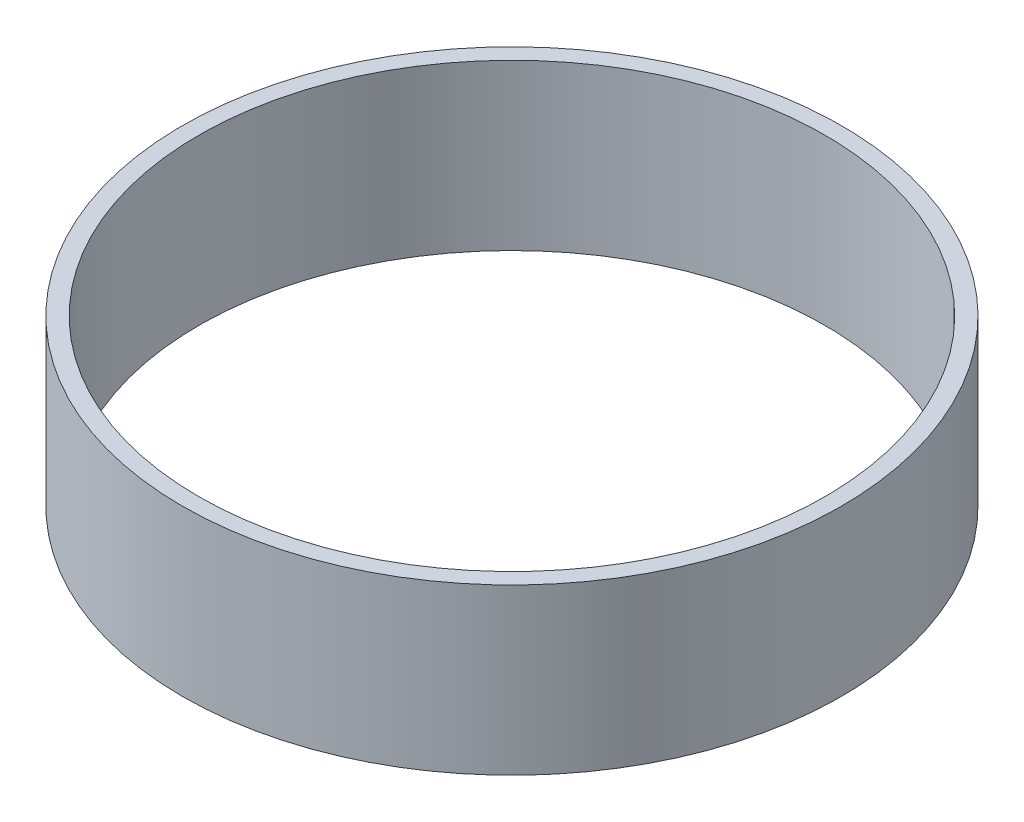
ISO-10303-21;
HEADER;
FILE_DESCRIPTION(('STEP AP214'),'2;1');
FILE_NAME('part.step','',(''),(''),'','','');
FILE_SCHEMA(('AUTOMOTIVE_DESIGN { 1 0 10303 214 1 1 1 1 }'));
ENDSEC;
DATA;
#1=APPLICATION_CONTEXT('core data for automotive mechanical design processes');
#2=APPLICATION_PROTOCOL_DEFINITION('international standard','automotive_design',2000,#1);
#3=PRODUCT_CONTEXT('',#1,'mechanical');
#4=PRODUCT('Part','Part','',(#3));
#5=PRODUCT_RELATED_PRODUCT_CATEGORY('part','',(#4));
#6=PRODUCT_DEFINITION_FORMATION('','',#4);
#7=PRODUCT_DEFINITION_CONTEXT('part definition',#1,'design');
#8=PRODUCT_DEFINITION('design','',#6,#7);
#9=PRODUCT_DEFINITION_SHAPE('','',#8);
#10=(LENGTH_UNIT() NAMED_UNIT(*) SI_UNIT(.MILLI.,.METRE.));
#11=(NAMED_UNIT(*) PLANE_ANGLE_UNIT() SI_UNIT($,.RADIAN.));
#12=(NAMED_UNIT(*) SI_UNIT($,.STERADIAN.) SOLID_ANGLE_UNIT());
#13=UNCERTAINTY_MEASURE_WITH_UNIT(LENGTH_MEASURE(1.E-05),#10,'distance_accuracy_value','');
#14=(GEOMETRIC_REPRESENTATION_CONTEXT(3) GLOBAL_UNCERTAINTY_ASSIGNED_CONTEXT((#13)) GLOBAL_UNIT_ASSIGNED_CONTEXT((#10,
#11,#12)) REPRESENTATION_CONTEXT('',''));
#15=CARTESIAN_POINT('',(0.,0.,0.));
#16=DIRECTION('',(0.,0.,1.));
#17=DIRECTION('',(1.,0.,0.));
#18=AXIS2_PLACEMENT_3D('',#15,#16,#17);
#19=CARTESIAN_POINT('',(0.,25.4,0.));
#20=DIRECTION('',(0.,1.,0.));
#21=DIRECTION('',(0.,0.,1.));
#22=AXIS2_PLACEMENT_3D('',#19,#20,#21);
#23=PLANE('',#22);
#24=CARTESIAN_POINT('',(0.,25.4,0.));
#25=DIRECTION('',(0.,1.,0.));
#26=DIRECTION('',(0.,0.,1.));
#27=AXIS2_PLACEMENT_3D('',#24,#25,#26);
#28=CIRCLE('',#27,50.8);
#29=CARTESIAN_POINT('',(0.,25.4,50.8));
#30=VERTEX_POINT('',#29);
#31=EDGE_CURVE('E10',#30,#30,#28,.T.);
#32=ORIENTED_EDGE('',*,*,#31,.T.);
#33=EDGE_LOOP('',(#32));
#34=FACE_BOUND('',#33,.T.);
#35=CARTESIAN_POINT('',(0.,25.4,0.));
#36=DIRECTION('',(0.,1.,0.));
#37=DIRECTION('',(0.,0.,1.));
#38=AXIS2_PLACEMENT_3D('',#35,#36,#37);
#39=CIRCLE('',#38,48.26);
#40=CARTESIAN_POINT('',(0.,25.4,48.26));
#41=VERTEX_POINT('',#40);
#42=EDGE_CURVE('E51',#41,#41,#39,.T.);
#43=ORIENTED_EDGE('',*,*,#42,.F.);
#44=EDGE_LOOP('',(#43));
#45=FACE_BOUND('',#44,.T.);
#46=ADVANCED_FACE('F38',(#34,#45),#23,.T.);
#47=CARTESIAN_POINT('',(0.,0.,0.));
#48=DIRECTION('',(0.,1.,0.));
#49=DIRECTION('',(0.,0.,1.));
#50=AXIS2_PLACEMENT_3D('',#47,#48,#49);
#51=PLANE('',#50);
#52=CARTESIAN_POINT('',(0.,0.,0.));
#53=DIRECTION('',(0.,1.,0.));
#54=DIRECTION('',(0.,0.,1.));
#55=AXIS2_PLACEMENT_3D('',#52,#53,#54);
#56=CIRCLE('',#55,50.8);
#57=CARTESIAN_POINT('',(0.,0.,50.8));
#58=VERTEX_POINT('',#57);
#59=EDGE_CURVE('E42',#58,#58,#56,.T.);
#60=ORIENTED_EDGE('',*,*,#59,.F.);
#61=EDGE_LOOP('',(#60));
#62=FACE_BOUND('',#61,.T.);
#63=CARTESIAN_POINT('',(0.,0.,0.));
#64=DIRECTION('',(0.,1.,0.));
#65=DIRECTION('',(0.,0.,1.));
#66=AXIS2_PLACEMENT_3D('',#63,#64,#65);
#67=CIRCLE('',#66,48.26);
#68=CARTESIAN_POINT('',(0.,0.,48.26));
#69=VERTEX_POINT('',#68);
#70=EDGE_CURVE('E53',#69,#69,#67,.T.);
#71=ORIENTED_EDGE('',*,*,#70,.T.);
#72=EDGE_LOOP('',(#71));
#73=FACE_BOUND('',#72,.T.);
#74=ADVANCED_FACE('F65',(#62,#73),#51,.F.);
#75=CARTESIAN_POINT('',(0.,25.4,0.));
#76=DIRECTION('',(0.,-1.,0.));
#77=DIRECTION('',(0.,0.,-1.));
#78=AXIS2_PLACEMENT_3D('',#75,#76,#77);
#79=CYLINDRICAL_SURFACE('',#78,50.8);
#80=ORIENTED_EDGE('',*,*,#31,.F.);
#81=EDGE_LOOP('',(#80));
#82=FACE_BOUND('',#81,.T.);
#83=ORIENTED_EDGE('',*,*,#59,.T.);
#84=EDGE_LOOP('',(#83));
#85=FACE_BOUND('',#84,.T.);
#86=ADVANCED_FACE('F40',(#82,#85),#79,.T.);
#87=CARTESIAN_POINT('',(0.,25.4,0.));
#88=DIRECTION('',(0.,-1.,0.));
#89=DIRECTION('',(0.,0.,-1.));
#90=AXIS2_PLACEMENT_3D('',#87,#88,#89);
#91=CYLINDRICAL_SURFACE('',#90,48.26);
#92=ORIENTED_EDGE('',*,*,#42,.T.);
#93=EDGE_LOOP('',(#92));
#94=FACE_BOUND('',#93,.T.);
#95=ORIENTED_EDGE('',*,*,#70,.F.);
#96=EDGE_LOOP('',(#95));
#97=FACE_BOUND('',#96,.T.);
#98=ADVANCED_FACE('F61',(#94,#97),#91,.F.);
#99=CLOSED_SHELL('',(#46,#74,#86,#98));
#100=MANIFOLD_SOLID_BREP('B2',#99);
#101=ADVANCED_BREP_SHAPE_REPRESENTATION('',(#18,#100),#14);
#102=SHAPE_DEFINITION_REPRESENTATION(#9,#101);
ENDSEC;
END-ISO-10303-21;
